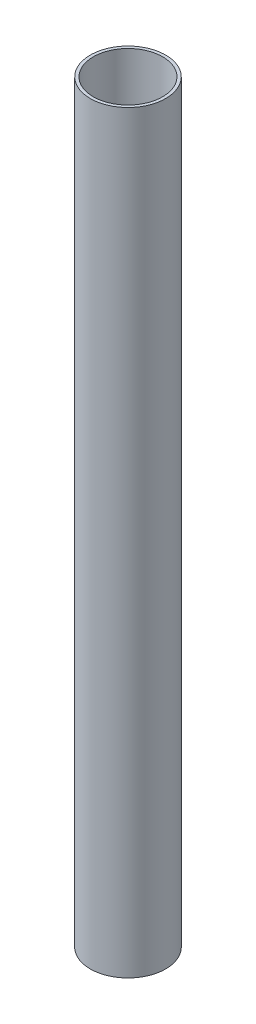
ISO-10303-21;
HEADER;
FILE_DESCRIPTION(('STEP AP214'),'2;1');
FILE_NAME('part.step','',(''),(''),'','','');
FILE_SCHEMA(('AUTOMOTIVE_DESIGN { 1 0 10303 214 1 1 1 1 }'));
ENDSEC;
DATA;
#1=APPLICATION_CONTEXT('core data for automotive mechanical design processes');
#2=APPLICATION_PROTOCOL_DEFINITION('international standard','automotive_design',2000,#1);
#3=PRODUCT_CONTEXT('',#1,'mechanical');
#4=PRODUCT('Part','Part','',(#3));
#5=PRODUCT_RELATED_PRODUCT_CATEGORY('part','',(#4));
#6=PRODUCT_DEFINITION_FORMATION('','',#4);
#7=PRODUCT_DEFINITION_CONTEXT('part definition',#1,'design');
#8=PRODUCT_DEFINITION('design','',#6,#7);
#9=PRODUCT_DEFINITION_SHAPE('','',#8);
#10=(LENGTH_UNIT() NAMED_UNIT(*) SI_UNIT(.MILLI.,.METRE.));
#11=(NAMED_UNIT(*) PLANE_ANGLE_UNIT() SI_UNIT($,.RADIAN.));
#12=(NAMED_UNIT(*) SI_UNIT($,.STERADIAN.) SOLID_ANGLE_UNIT());
#13=UNCERTAINTY_MEASURE_WITH_UNIT(LENGTH_MEASURE(1.E-05),#10,'distance_accuracy_value','');
#14=(GEOMETRIC_REPRESENTATION_CONTEXT(3) GLOBAL_UNCERTAINTY_ASSIGNED_CONTEXT((#13)) GLOBAL_UNIT_ASSIGNED_CONTEXT((#10,
#11,#12)) REPRESENTATION_CONTEXT('',''));
#15=CARTESIAN_POINT('',(0.,0.,0.));
#16=DIRECTION('',(0.,0.,1.));
#17=DIRECTION('',(1.,0.,0.));
#18=AXIS2_PLACEMENT_3D('',#15,#16,#17);
#19=CARTESIAN_POINT('',(0.,31.75,0.));
#20=DIRECTION('',(0.,-1.,0.));
#21=DIRECTION('',(0.,0.,-1.));
#22=AXIS2_PLACEMENT_3D('',#19,#20,#21);
#23=CYLINDRICAL_SURFACE('',#22,1.5875);
#24=CARTESIAN_POINT('',(0.,31.75,0.));
#25=DIRECTION('',(0.,1.,0.));
#26=DIRECTION('',(0.,0.,1.));
#27=AXIS2_PLACEMENT_3D('',#24,#25,#26);
#28=CIRCLE('',#27,1.5875);
#29=CARTESIAN_POINT('',(0.,31.75,1.5875));
#30=VERTEX_POINT('',#29);
#31=EDGE_CURVE('E10',#30,#30,#28,.T.);
#32=ORIENTED_EDGE('',*,*,#31,.F.);
#33=EDGE_LOOP('',(#32));
#34=FACE_BOUND('',#33,.T.);
#35=CARTESIAN_POINT('',(0.,0.,0.));
#36=DIRECTION('',(0.,1.,0.));
#37=DIRECTION('',(0.,0.,1.));
#38=AXIS2_PLACEMENT_3D('',#35,#36,#37);
#39=CIRCLE('',#38,1.5875);
#40=CARTESIAN_POINT('',(0.,0.,1.5875));
#41=VERTEX_POINT('',#40);
#42=EDGE_CURVE('E48',#41,#41,#39,.T.);
#43=ORIENTED_EDGE('',*,*,#42,.T.);
#44=EDGE_LOOP('',(#43));
#45=FACE_BOUND('',#44,.T.);
#46=ADVANCED_FACE('F44',(#34,#45),#23,.T.);
#47=CARTESIAN_POINT('',(0.,31.75,0.));
#48=DIRECTION('',(0.,1.,0.));
#49=DIRECTION('',(0.,0.,1.));
#50=AXIS2_PLACEMENT_3D('',#47,#48,#49);
#51=PLANE('',#50);
#52=CARTESIAN_POINT('',(0.,31.75,0.));
#53=DIRECTION('',(0.,1.,0.));
#54=DIRECTION('',(0.,0.,1.));
#55=AXIS2_PLACEMENT_3D('',#52,#53,#54);
#56=CIRCLE('',#55,1.4605);
#57=CARTESIAN_POINT('',(0.,31.75,1.4605));
#58=VERTEX_POINT('',#57);
#59=EDGE_CURVE('E60',#58,#58,#56,.T.);
#60=ORIENTED_EDGE('',*,*,#59,.F.);
#61=EDGE_LOOP('',(#60));
#62=FACE_BOUND('',#61,.T.);
#63=ORIENTED_EDGE('',*,*,#31,.T.);
#64=EDGE_LOOP('',(#63));
#65=FACE_BOUND('',#64,.T.);
#66=ADVANCED_FACE('F68',(#62,#65),#51,.T.);
#67=CARTESIAN_POINT('',(0.,0.,0.));
#68=DIRECTION('',(0.,1.,0.));
#69=DIRECTION('',(0.,0.,1.));
#70=AXIS2_PLACEMENT_3D('',#67,#68,#69);
#71=PLANE('',#70);
#72=CARTESIAN_POINT('',(0.,0.,0.));
#73=DIRECTION('',(0.,1.,0.));
#74=DIRECTION('',(0.,0.,1.));
#75=AXIS2_PLACEMENT_3D('',#72,#73,#74);
#76=CIRCLE('',#75,1.4605);
#77=CARTESIAN_POINT('',(0.,0.,1.4605));
#78=VERTEX_POINT('',#77);
#79=EDGE_CURVE('E56',#78,#78,#76,.T.);
#80=ORIENTED_EDGE('',*,*,#79,.T.);
#81=EDGE_LOOP('',(#80));
#82=FACE_BOUND('',#81,.T.);
#83=ORIENTED_EDGE('',*,*,#42,.F.);
#84=EDGE_LOOP('',(#83));
#85=FACE_BOUND('',#84,.T.);
#86=ADVANCED_FACE('F75',(#82,#85),#71,.F.);
#87=CARTESIAN_POINT('',(0.,31.75,0.));
#88=DIRECTION('',(0.,-1.,0.));
#89=DIRECTION('',(0.,0.,-1.));
#90=AXIS2_PLACEMENT_3D('',#87,#88,#89);
#91=CYLINDRICAL_SURFACE('',#90,1.4605);
#92=ORIENTED_EDGE('',*,*,#59,.T.);
#93=EDGE_LOOP('',(#92));
#94=FACE_BOUND('',#93,.T.);
#95=ORIENTED_EDGE('',*,*,#79,.F.);
#96=EDGE_LOOP('',(#95));
#97=FACE_BOUND('',#96,.T.);
#98=ADVANCED_FACE('F69',(#94,#97),#91,.F.);
#99=CLOSED_SHELL('',(#46,#66,#86,#98));
#100=MANIFOLD_SOLID_BREP('B2',#99);
#101=ADVANCED_BREP_SHAPE_REPRESENTATION('',(#18,#100),#14);
#102=SHAPE_DEFINITION_REPRESENTATION(#9,#101);
ENDSEC;
END-ISO-10303-21;
